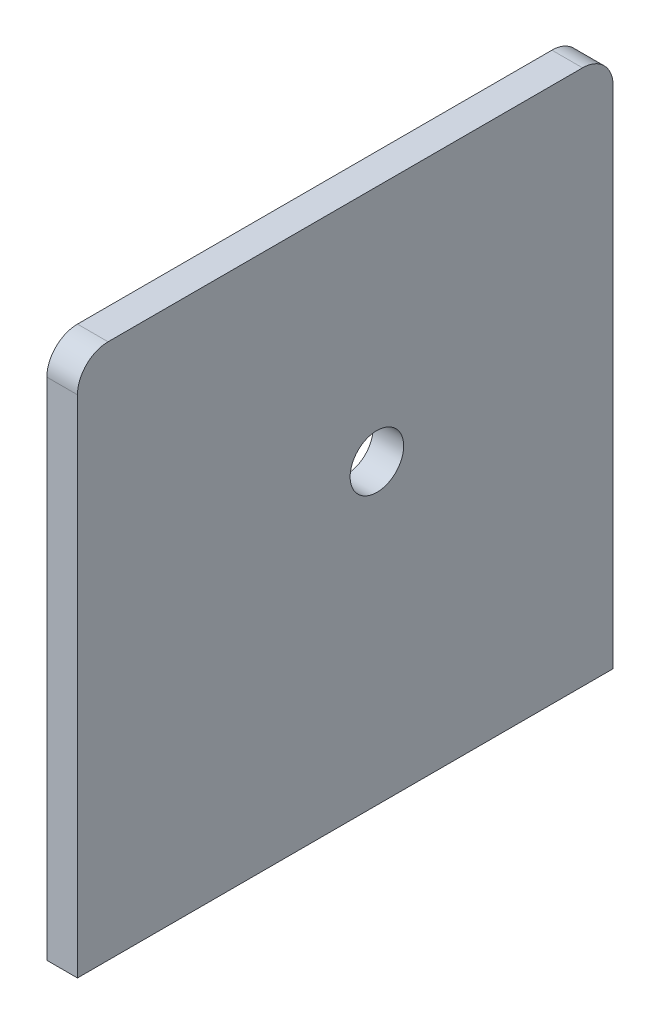
ISO-10303-21;
HEADER;
FILE_DESCRIPTION(('STEP AP214'),'2;1');
FILE_NAME('part.step','',(''),(''),'','','');
FILE_SCHEMA(('AUTOMOTIVE_DESIGN { 1 0 10303 214 1 1 1 1 }'));
ENDSEC;
DATA;
#1=APPLICATION_CONTEXT('core data for automotive mechanical design processes');
#2=APPLICATION_PROTOCOL_DEFINITION('international standard','automotive_design',2000,#1);
#3=PRODUCT_CONTEXT('',#1,'mechanical');
#4=PRODUCT('Part','Part','',(#3));
#5=PRODUCT_RELATED_PRODUCT_CATEGORY('part','',(#4));
#6=PRODUCT_DEFINITION_FORMATION('','',#4);
#7=PRODUCT_DEFINITION_CONTEXT('part definition',#1,'design');
#8=PRODUCT_DEFINITION('design','',#6,#7);
#9=PRODUCT_DEFINITION_SHAPE('','',#8);
#10=(LENGTH_UNIT() NAMED_UNIT(*) SI_UNIT(.MILLI.,.METRE.));
#11=(NAMED_UNIT(*) PLANE_ANGLE_UNIT() SI_UNIT($,.RADIAN.));
#12=(NAMED_UNIT(*) SI_UNIT($,.STERADIAN.) SOLID_ANGLE_UNIT());
#13=UNCERTAINTY_MEASURE_WITH_UNIT(LENGTH_MEASURE(1.E-05),#10,'distance_accuracy_value','');
#14=(GEOMETRIC_REPRESENTATION_CONTEXT(3) GLOBAL_UNCERTAINTY_ASSIGNED_CONTEXT((#13)) GLOBAL_UNIT_ASSIGNED_CONTEXT((#10,
#11,#12)) REPRESENTATION_CONTEXT('',''));
#15=CARTESIAN_POINT('',(0.,0.,0.));
#16=DIRECTION('',(0.,0.,1.));
#17=DIRECTION('',(1.,0.,0.));
#18=AXIS2_PLACEMENT_3D('',#15,#16,#17);
#19=CARTESIAN_POINT('',(-28.2713050323184,3.,0.));
#20=DIRECTION('',(-1.,0.,0.));
#21=DIRECTION('',(0.,0.,1.));
#22=AXIS2_PLACEMENT_3D('',#19,#20,#21);
#23=PLANE('',#22);
#24=CARTESIAN_POINT('',(-28.2713050323184,38.8938931933046,-8.02072759012875));
#25=DIRECTION('',(-1.,0.,0.));
#26=DIRECTION('',(0.,0.,1.));
#27=AXIS2_PLACEMENT_3D('',#24,#25,#26);
#28=CIRCLE('',#27,3.5);
#29=CARTESIAN_POINT('',(-28.2713050323184,38.8938931933046,-11.5207275901287));
#30=VERTEX_POINT('',#29);
#31=EDGE_CURVE('E151',#30,#30,#28,.F.);
#32=ORIENTED_EDGE('',*,*,#31,.T.);
#33=EDGE_LOOP('',(#32));
#34=FACE_BOUND('',#33,.T.);
#35=DIRECTION('',(0.,0.,-1.));
#36=VECTOR('',#35,1.);
#37=CARTESIAN_POINT('',(-28.2713050323184,70.,31.1061840627299));
#38=LINE('',#37,#36);
#39=CARTESIAN_POINT('',(-28.2713050323184,70.,27.1061840627299));
#40=VERTEX_POINT('',#39);
#41=CARTESIAN_POINT('',(-28.2713050323184,70.,-34.8938159372701));
#42=VERTEX_POINT('',#41);
#43=EDGE_CURVE('E145',#40,#42,#38,.T.);
#44=ORIENTED_EDGE('',*,*,#43,.T.);
#45=CARTESIAN_POINT('',(-28.2713050323184,66.,-34.8938159372701));
#46=DIRECTION('',(-1.,0.,0.));
#47=DIRECTION('',(0.,0.,1.));
#48=AXIS2_PLACEMENT_3D('',#45,#46,#47);
#49=CIRCLE('',#48,4.);
#50=CARTESIAN_POINT('',(-28.2713050323184,66.,-38.8938159372701));
#51=VERTEX_POINT('',#50);
#52=EDGE_CURVE('E132',#42,#51,#49,.T.);
#53=ORIENTED_EDGE('',*,*,#52,.T.);
#54=DIRECTION('',(0.,-1.,0.));
#55=VECTOR('',#54,1.);
#56=CARTESIAN_POINT('',(-28.2713050323184,3.,-38.8938159372701));
#57=LINE('',#56,#55);
#58=CARTESIAN_POINT('',(-28.2713050323184,0.,-38.8938159372701));
#59=VERTEX_POINT('',#58);
#60=EDGE_CURVE('E106',#51,#59,#57,.T.);
#61=ORIENTED_EDGE('',*,*,#60,.T.);
#62=DIRECTION('',(0.,0.,-1.));
#63=VECTOR('',#62,1.);
#64=CARTESIAN_POINT('',(-28.2713050323184,0.,0.));
#65=LINE('',#64,#63);
#66=CARTESIAN_POINT('',(-28.2713050323184,0.,31.1061840627299));
#67=VERTEX_POINT('',#66);
#68=EDGE_CURVE('E104',#67,#59,#65,.T.);
#69=ORIENTED_EDGE('',*,*,#68,.F.);
#70=DIRECTION('',(0.,-1.,0.));
#71=VECTOR('',#70,1.);
#72=CARTESIAN_POINT('',(-28.2713050323184,3.,31.1061840627299));
#73=LINE('',#72,#71);
#74=CARTESIAN_POINT('',(-28.2713050323184,66.,31.1061840627299));
#75=VERTEX_POINT('',#74);
#76=EDGE_CURVE('E93',#75,#67,#73,.T.);
#77=ORIENTED_EDGE('',*,*,#76,.F.);
#78=CARTESIAN_POINT('',(-28.2713050323184,66.,27.1061840627299));
#79=DIRECTION('',(-1.,0.,0.));
#80=DIRECTION('',(0.,0.,1.));
#81=AXIS2_PLACEMENT_3D('',#78,#79,#80);
#82=CIRCLE('',#81,4.);
#83=EDGE_CURVE('E130',#75,#40,#82,.T.);
#84=ORIENTED_EDGE('',*,*,#83,.T.);
#85=EDGE_LOOP('',(#44,#53,#61,#69,#77,#84));
#86=FACE_BOUND('',#85,.T.);
#87=ADVANCED_FACE('F37',(#34,#86),#23,.T.);
#88=CARTESIAN_POINT('',(0.,3.,31.1061840627299));
#89=DIRECTION('',(0.,0.,1.));
#90=DIRECTION('',(1.,0.,0.));
#91=AXIS2_PLACEMENT_3D('',#88,#89,#90);
#92=PLANE('',#91);
#93=DIRECTION('',(0.,-1.,0.));
#94=VECTOR('',#93,1.);
#95=CARTESIAN_POINT('',(-24.2713050323184,3.,31.1061840627299));
#96=LINE('',#95,#94);
#97=CARTESIAN_POINT('',(-24.2713050323184,66.,31.1061840627299));
#98=VERTEX_POINT('',#97);
#99=CARTESIAN_POINT('',(-24.2713050323184,0.,31.1061840627299));
#100=VERTEX_POINT('',#99);
#101=EDGE_CURVE('E101',#98,#100,#96,.T.);
#102=ORIENTED_EDGE('',*,*,#101,.F.);
#103=DIRECTION('',(-1.,0.,0.));
#104=VECTOR('',#103,1.);
#105=CARTESIAN_POINT('',(-28.2713050323184,66.,31.1061840627299));
#106=LINE('',#105,#104);
#107=EDGE_CURVE('E11',#98,#75,#106,.T.);
#108=ORIENTED_EDGE('',*,*,#107,.T.);
#109=ORIENTED_EDGE('',*,*,#76,.T.);
#110=DIRECTION('',(-1.,0.,0.));
#111=VECTOR('',#110,1.);
#112=CARTESIAN_POINT('',(0.,0.,31.1061840627299));
#113=LINE('',#112,#111);
#114=EDGE_CURVE('E97',#100,#67,#113,.T.);
#115=ORIENTED_EDGE('',*,*,#114,.F.);
#116=EDGE_LOOP('',(#102,#108,#109,#115));
#117=FACE_BOUND('',#116,.T.);
#118=ADVANCED_FACE('F95',(#117),#92,.T.);
#119=CARTESIAN_POINT('',(-24.2713050323184,3.,0.));
#120=DIRECTION('',(-1.,0.,0.));
#121=DIRECTION('',(0.,0.,1.));
#122=AXIS2_PLACEMENT_3D('',#119,#120,#121);
#123=PLANE('',#122);
#124=CARTESIAN_POINT('',(-24.2713050323184,38.8938931933046,-8.02072759012875));
#125=DIRECTION('',(-1.,0.,0.));
#126=DIRECTION('',(0.,0.,1.));
#127=AXIS2_PLACEMENT_3D('',#124,#125,#126);
#128=CIRCLE('',#127,3.5);
#129=CARTESIAN_POINT('',(-24.2713050323184,38.8938931933046,-11.5207275901287));
#130=VERTEX_POINT('',#129);
#131=EDGE_CURVE('E41',#130,#130,#128,.T.);
#132=ORIENTED_EDGE('',*,*,#131,.T.);
#133=EDGE_LOOP('',(#132));
#134=FACE_BOUND('',#133,.T.);
#135=DIRECTION('',(0.,-1.,0.));
#136=VECTOR('',#135,1.);
#137=CARTESIAN_POINT('',(-24.2713050323184,3.,-38.8938159372701));
#138=LINE('',#137,#136);
#139=CARTESIAN_POINT('',(-24.2713050323184,66.,-38.8938159372701));
#140=VERTEX_POINT('',#139);
#141=CARTESIAN_POINT('',(-24.2713050323184,0.,-38.8938159372701));
#142=VERTEX_POINT('',#141);
#143=EDGE_CURVE('E123',#140,#142,#138,.T.);
#144=ORIENTED_EDGE('',*,*,#143,.F.);
#145=CARTESIAN_POINT('',(-24.2713050323184,66.,-34.8938159372701));
#146=DIRECTION('',(-1.,0.,0.));
#147=DIRECTION('',(0.,0.,1.));
#148=AXIS2_PLACEMENT_3D('',#145,#146,#147);
#149=CIRCLE('',#148,4.);
#150=CARTESIAN_POINT('',(-24.2713050323184,70.,-34.8938159372701));
#151=VERTEX_POINT('',#150);
#152=EDGE_CURVE('E46',#140,#151,#149,.F.);
#153=ORIENTED_EDGE('',*,*,#152,.T.);
#154=DIRECTION('',(0.,0.,-1.));
#155=VECTOR('',#154,1.);
#156=CARTESIAN_POINT('',(-24.2713050323184,70.,31.1061840627299));
#157=LINE('',#156,#155);
#158=CARTESIAN_POINT('',(-24.2713050323184,70.,27.1061840627299));
#159=VERTEX_POINT('',#158);
#160=EDGE_CURVE('E110',#159,#151,#157,.T.);
#161=ORIENTED_EDGE('',*,*,#160,.F.);
#162=CARTESIAN_POINT('',(-24.2713050323184,66.,27.1061840627299));
#163=DIRECTION('',(-1.,0.,0.));
#164=DIRECTION('',(0.,0.,1.));
#165=AXIS2_PLACEMENT_3D('',#162,#163,#164);
#166=CIRCLE('',#165,4.);
#167=EDGE_CURVE('E53',#159,#98,#166,.F.);
#168=ORIENTED_EDGE('',*,*,#167,.T.);
#169=ORIENTED_EDGE('',*,*,#101,.T.);
#170=DIRECTION('',(0.,0.,-1.));
#171=VECTOR('',#170,1.);
#172=CARTESIAN_POINT('',(-24.2713050323184,0.,0.));
#173=LINE('',#172,#171);
#174=EDGE_CURVE('E115',#100,#142,#173,.T.);
#175=ORIENTED_EDGE('',*,*,#174,.T.);
#176=EDGE_LOOP('',(#144,#153,#161,#168,#169,#175));
#177=FACE_BOUND('',#176,.T.);
#178=ADVANCED_FACE('F138',(#134,#177),#123,.F.);
#179=CARTESIAN_POINT('',(0.,3.,-38.8938159372702));
#180=DIRECTION('',(0.,0.,1.));
#181=DIRECTION('',(1.,0.,0.));
#182=AXIS2_PLACEMENT_3D('',#179,#180,#181);
#183=PLANE('',#182);
#184=ORIENTED_EDGE('',*,*,#60,.F.);
#185=DIRECTION('',(-1.,0.,0.));
#186=VECTOR('',#185,1.);
#187=CARTESIAN_POINT('',(0.,66.,-38.8938159372702));
#188=LINE('',#187,#186);
#189=EDGE_CURVE('E61',#51,#140,#188,.F.);
#190=ORIENTED_EDGE('',*,*,#189,.T.);
#191=ORIENTED_EDGE('',*,*,#143,.T.);
#192=DIRECTION('',(-1.,0.,0.));
#193=VECTOR('',#192,1.);
#194=CARTESIAN_POINT('',(0.,0.,-38.8938159372702));
#195=LINE('',#194,#193);
#196=EDGE_CURVE('E117',#142,#59,#195,.T.);
#197=ORIENTED_EDGE('',*,*,#196,.T.);
#198=EDGE_LOOP('',(#184,#190,#191,#197));
#199=FACE_BOUND('',#198,.T.);
#200=ADVANCED_FACE('F147',(#199),#183,.F.);
#201=CARTESIAN_POINT('',(0.,0.,0.));
#202=DIRECTION('',(0.,1.,0.));
#203=DIRECTION('',(0.,0.,1.));
#204=AXIS2_PLACEMENT_3D('',#201,#202,#203);
#205=PLANE('',#204);
#206=ORIENTED_EDGE('',*,*,#68,.T.);
#207=ORIENTED_EDGE('',*,*,#196,.F.);
#208=ORIENTED_EDGE('',*,*,#174,.F.);
#209=ORIENTED_EDGE('',*,*,#114,.T.);
#210=EDGE_LOOP('',(#206,#207,#208,#209));
#211=FACE_BOUND('',#210,.T.);
#212=ADVANCED_FACE('F113',(#211),#205,.F.);
#213=CARTESIAN_POINT('',(0.,70.,0.));
#214=DIRECTION('',(0.,-1.,0.));
#215=DIRECTION('',(0.,0.,-1.));
#216=AXIS2_PLACEMENT_3D('',#213,#214,#215);
#217=PLANE('',#216);
#218=ORIENTED_EDGE('',*,*,#160,.T.);
#219=DIRECTION('',(-1.,0.,0.));
#220=VECTOR('',#219,1.);
#221=CARTESIAN_POINT('',(0.,70.,-34.8938159372702));
#222=LINE('',#221,#220);
#223=EDGE_CURVE('E127',#151,#42,#222,.T.);
#224=ORIENTED_EDGE('',*,*,#223,.T.);
#225=ORIENTED_EDGE('',*,*,#43,.F.);
#226=DIRECTION('',(-1.,0.,0.));
#227=VECTOR('',#226,1.);
#228=CARTESIAN_POINT('',(-24.2713050323184,70.,27.1061840627299));
#229=LINE('',#228,#227);
#230=EDGE_CURVE('E100',#40,#159,#229,.F.);
#231=ORIENTED_EDGE('',*,*,#230,.T.);
#232=EDGE_LOOP('',(#218,#224,#225,#231));
#233=FACE_BOUND('',#232,.T.);
#234=ADVANCED_FACE('F142',(#233),#217,.F.);
#235=CARTESIAN_POINT('',(0.,66.,-34.8938159372702));
#236=DIRECTION('',(-1.,0.,0.));
#237=DIRECTION('',(0.,0.,1.));
#238=AXIS2_PLACEMENT_3D('',#235,#236,#237);
#239=CYLINDRICAL_SURFACE('',#238,4.);
#240=ORIENTED_EDGE('',*,*,#152,.F.);
#241=ORIENTED_EDGE('',*,*,#189,.F.);
#242=ORIENTED_EDGE('',*,*,#52,.F.);
#243=ORIENTED_EDGE('',*,*,#223,.F.);
#244=EDGE_LOOP('',(#240,#241,#242,#243));
#245=FACE_BOUND('',#244,.T.);
#246=ADVANCED_FACE('F146',(#245),#239,.T.);
#247=CARTESIAN_POINT('',(0.,66.,27.1061840627299));
#248=DIRECTION('',(1.,0.,0.));
#249=DIRECTION('',(0.,0.,-1.));
#250=AXIS2_PLACEMENT_3D('',#247,#248,#249);
#251=CYLINDRICAL_SURFACE('',#250,4.);
#252=ORIENTED_EDGE('',*,*,#167,.F.);
#253=ORIENTED_EDGE('',*,*,#230,.F.);
#254=ORIENTED_EDGE('',*,*,#83,.F.);
#255=ORIENTED_EDGE('',*,*,#107,.F.);
#256=EDGE_LOOP('',(#252,#253,#254,#255));
#257=FACE_BOUND('',#256,.T.);
#258=ADVANCED_FACE('F39',(#257),#251,.T.);
#259=CARTESIAN_POINT('',(-38.17079996893,38.8938931933046,-8.02072759012875));
#260=DIRECTION('',(1.,0.,0.));
#261=DIRECTION('',(0.,0.,-1.));
#262=AXIS2_PLACEMENT_3D('',#259,#260,#261);
#263=CYLINDRICAL_SURFACE('',#262,3.5);
#264=CARTESIAN_POINT('',(-28.2713050323184,38.8938931933046,-11.5207275901287));
#265=CARTESIAN_POINT('',(-28.2296383656517,38.8938931933046,-11.5207275901287));
#266=CARTESIAN_POINT('',(-28.187971698985,38.8938931933046,-11.5207275901287));
#267=CARTESIAN_POINT('',(-28.1046383656517,38.8938931933046,-11.5207275901287));
#268=CARTESIAN_POINT('',(-28.062971698985,38.8938931933046,-11.5207275901287));
#269=CARTESIAN_POINT('',(-27.9796383656517,38.8938931933046,-11.5207275901287));
#270=CARTESIAN_POINT('',(-27.937971698985,38.8938931933046,-11.5207275901287));
#271=CARTESIAN_POINT('',(-27.8546383656517,38.8938931933046,-11.5207275901287));
#272=CARTESIAN_POINT('',(-27.812971698985,38.8938931933046,-11.5207275901287));
#273=CARTESIAN_POINT('',(-27.7296383656517,38.8938931933046,-11.5207275901287));
#274=CARTESIAN_POINT('',(-27.687971698985,38.8938931933046,-11.5207275901287));
#275=CARTESIAN_POINT('',(-27.6046383656517,38.8938931933046,-11.5207275901287));
#276=CARTESIAN_POINT('',(-27.562971698985,38.8938931933046,-11.5207275901287));
#277=CARTESIAN_POINT('',(-27.4796383656517,38.8938931933046,-11.5207275901287));
#278=CARTESIAN_POINT('',(-27.437971698985,38.8938931933046,-11.5207275901287));
#279=CARTESIAN_POINT('',(-27.3546383656517,38.8938931933046,-11.5207275901287));
#280=CARTESIAN_POINT('',(-27.312971698985,38.8938931933046,-11.5207275901287));
#281=CARTESIAN_POINT('',(-27.2296383656517,38.8938931933046,-11.5207275901287));
#282=CARTESIAN_POINT('',(-27.187971698985,38.8938931933046,-11.5207275901287));
#283=CARTESIAN_POINT('',(-27.1046383656517,38.8938931933046,-11.5207275901287));
#284=CARTESIAN_POINT('',(-27.062971698985,38.8938931933046,-11.5207275901287));
#285=CARTESIAN_POINT('',(-26.9796383656517,38.8938931933046,-11.5207275901287));
#286=CARTESIAN_POINT('',(-26.937971698985,38.8938931933046,-11.5207275901287));
#287=CARTESIAN_POINT('',(-26.8546383656517,38.8938931933046,-11.5207275901287));
#288=CARTESIAN_POINT('',(-26.812971698985,38.8938931933046,-11.5207275901287));
#289=CARTESIAN_POINT('',(-26.7296383656517,38.8938931933046,-11.5207275901287));
#290=CARTESIAN_POINT('',(-26.687971698985,38.8938931933046,-11.5207275901287));
#291=CARTESIAN_POINT('',(-26.6046383656517,38.8938931933046,-11.5207275901287));
#292=CARTESIAN_POINT('',(-26.562971698985,38.8938931933046,-11.5207275901287));
#293=CARTESIAN_POINT('',(-26.4796383656517,38.8938931933046,-11.5207275901287));
#294=CARTESIAN_POINT('',(-26.437971698985,38.8938931933046,-11.5207275901287));
#295=CARTESIAN_POINT('',(-26.3546383656517,38.8938931933046,-11.5207275901287));
#296=CARTESIAN_POINT('',(-26.312971698985,38.8938931933046,-11.5207275901287));
#297=CARTESIAN_POINT('',(-26.2296383656517,38.8938931933046,-11.5207275901287));
#298=CARTESIAN_POINT('',(-26.187971698985,38.8938931933046,-11.5207275901287));
#299=CARTESIAN_POINT('',(-26.1046383656517,38.8938931933046,-11.5207275901287));
#300=CARTESIAN_POINT('',(-26.062971698985,38.8938931933046,-11.5207275901287));
#301=CARTESIAN_POINT('',(-25.9796383656517,38.8938931933046,-11.5207275901287));
#302=CARTESIAN_POINT('',(-25.937971698985,38.8938931933046,-11.5207275901287));
#303=CARTESIAN_POINT('',(-25.8546383656517,38.8938931933046,-11.5207275901287));
#304=CARTESIAN_POINT('',(-25.812971698985,38.8938931933046,-11.5207275901287));
#305=CARTESIAN_POINT('',(-25.7296383656517,38.8938931933046,-11.5207275901287));
#306=CARTESIAN_POINT('',(-25.687971698985,38.8938931933046,-11.5207275901287));
#307=CARTESIAN_POINT('',(-25.6046383656517,38.8938931933046,-11.5207275901287));
#308=CARTESIAN_POINT('',(-25.562971698985,38.8938931933046,-11.5207275901287));
#309=CARTESIAN_POINT('',(-25.4796383656517,38.8938931933046,-11.5207275901287));
#310=CARTESIAN_POINT('',(-25.437971698985,38.8938931933046,-11.5207275901287));
#311=CARTESIAN_POINT('',(-25.3546383656517,38.8938931933046,-11.5207275901287));
#312=CARTESIAN_POINT('',(-25.312971698985,38.8938931933046,-11.5207275901287));
#313=CARTESIAN_POINT('',(-25.2296383656517,38.8938931933046,-11.5207275901287));
#314=CARTESIAN_POINT('',(-25.187971698985,38.8938931933046,-11.5207275901287));
#315=CARTESIAN_POINT('',(-25.1046383656517,38.8938931933046,-11.5207275901287));
#316=CARTESIAN_POINT('',(-25.062971698985,38.8938931933046,-11.5207275901287));
#317=CARTESIAN_POINT('',(-24.9796383656517,38.8938931933046,-11.5207275901287));
#318=CARTESIAN_POINT('',(-24.937971698985,38.8938931933046,-11.5207275901287));
#319=CARTESIAN_POINT('',(-24.8546383656517,38.8938931933046,-11.5207275901287));
#320=CARTESIAN_POINT('',(-24.812971698985,38.8938931933046,-11.5207275901287));
#321=CARTESIAN_POINT('',(-24.7296383656517,38.8938931933046,-11.5207275901287));
#322=CARTESIAN_POINT('',(-24.687971698985,38.8938931933046,-11.5207275901287));
#323=CARTESIAN_POINT('',(-24.6046383656517,38.8938931933046,-11.5207275901287));
#324=CARTESIAN_POINT('',(-24.562971698985,38.8938931933046,-11.5207275901287));
#325=CARTESIAN_POINT('',(-24.4796383656517,38.8938931933046,-11.5207275901287));
#326=CARTESIAN_POINT('',(-24.437971698985,38.8938931933046,-11.5207275901287));
#327=CARTESIAN_POINT('',(-24.3546383656517,38.8938931933046,-11.5207275901287));
#328=CARTESIAN_POINT('',(-24.312971698985,38.8938931933046,-11.5207275901287));
#329=CARTESIAN_POINT('',(-24.2713050323184,38.8938931933046,-11.5207275901287));
#330=B_SPLINE_CURVE_WITH_KNOTS('',3,(#264,#265,#266,#267,#268,#269,#270,#271,#272,#273,#274,
#275,#276,#277,#278,#279,#280,#281,#282,#283,#284,#285,#286,#287,#288,#289,#290,#291,#292,#293,
#294,#295,#296,#297,#298,#299,#300,#301,#302,#303,#304,#305,#306,#307,#308,#309,#310,#311,#312,
#313,#314,#315,#316,#317,#318,#319,#320,#321,#322,#323,#324,#325,#326,#327,#328,#329),
.UNSPECIFIED.,.F.,.F.,(4,2,2,2,2,2,2,2,2,2,2,2,2,2,2,2,2,2,2,2,2,2,2,2,2,2,2,2,2,2,2,2,4),(0.,
0.125,0.25,0.375,0.5,0.625000000000001,0.750000000000001,0.875000000000001,1.,1.125,1.25,1.375,
1.5,1.625,1.75,1.875,2.,2.125,2.25,2.375,2.5,2.625,2.75,2.875,3.,3.125,3.25,3.375,3.5,3.625,
3.75,3.875,4.),.UNSPECIFIED.);
#331=EDGE_CURVE('BSEAM157',#30,#130,#330,.T.);
#332=ORIENTED_EDGE('',*,*,#31,.F.);
#333=ORIENTED_EDGE('',*,*,#131,.F.);
#334=ORIENTED_EDGE('',*,*,#331,.T.);
#335=ORIENTED_EDGE('',*,*,#331,.F.);
#336=EDGE_LOOP('',(#332,#334,#333,#335));
#337=FACE_BOUND('',#336,.T.);
#338=ADVANCED_FACE('F157',(#337),#263,.F.);
#339=CLOSED_SHELL('',(#87,#118,#178,#200,#212,#234,#246,#258,#338));
#340=MANIFOLD_SOLID_BREP('B2',#339);
#341=ADVANCED_BREP_SHAPE_REPRESENTATION('',(#18,#340),#14);
#342=SHAPE_DEFINITION_REPRESENTATION(#9,#341);
ENDSEC;
END-ISO-10303-21;
